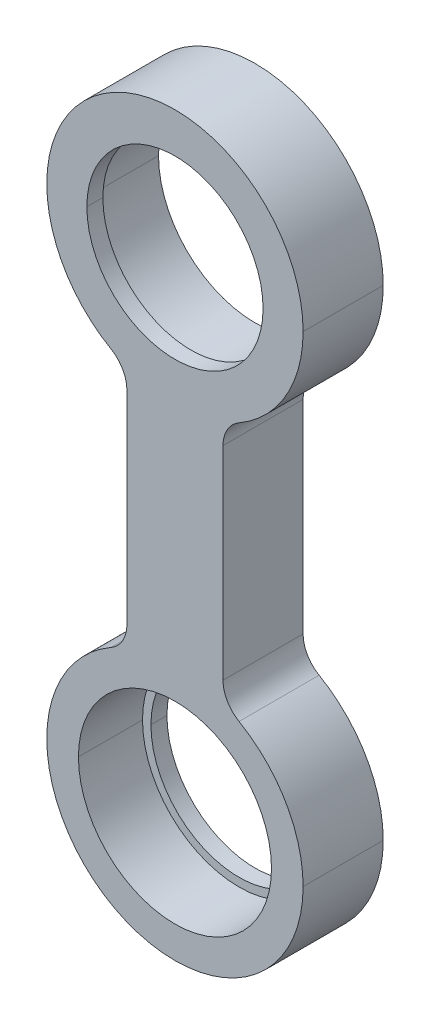
ISO-10303-21;
HEADER;
FILE_DESCRIPTION(('STEP AP214'),'2;1');
FILE_NAME('part.step','',(''),(''),'','','');
FILE_SCHEMA(('AUTOMOTIVE_DESIGN { 1 0 10303 214 1 1 1 1 }'));
ENDSEC;
DATA;
#1=APPLICATION_CONTEXT('core data for automotive mechanical design processes');
#2=APPLICATION_PROTOCOL_DEFINITION('international standard','automotive_design',2000,#1);
#3=PRODUCT_CONTEXT('',#1,'mechanical');
#4=PRODUCT('Part','Part','',(#3));
#5=PRODUCT_RELATED_PRODUCT_CATEGORY('part','',(#4));
#6=PRODUCT_DEFINITION_FORMATION('','',#4);
#7=PRODUCT_DEFINITION_CONTEXT('part definition',#1,'design');
#8=PRODUCT_DEFINITION('design','',#6,#7);
#9=PRODUCT_DEFINITION_SHAPE('','',#8);
#10=(LENGTH_UNIT() NAMED_UNIT(*) SI_UNIT(.MILLI.,.METRE.));
#11=(NAMED_UNIT(*) PLANE_ANGLE_UNIT() SI_UNIT($,.RADIAN.));
#12=(NAMED_UNIT(*) SI_UNIT($,.STERADIAN.) SOLID_ANGLE_UNIT());
#13=UNCERTAINTY_MEASURE_WITH_UNIT(LENGTH_MEASURE(1.E-05),#10,'distance_accuracy_value','');
#14=(GEOMETRIC_REPRESENTATION_CONTEXT(3) GLOBAL_UNCERTAINTY_ASSIGNED_CONTEXT((#13)) GLOBAL_UNIT_ASSIGNED_CONTEXT((#10,
#11,#12)) REPRESENTATION_CONTEXT('',''));
#15=CARTESIAN_POINT('',(0.,0.,0.));
#16=DIRECTION('',(0.,0.,1.));
#17=DIRECTION('',(1.,0.,0.));
#18=AXIS2_PLACEMENT_3D('',#15,#16,#17);
#19=CARTESIAN_POINT('',(0.,0.,1.));
#20=DIRECTION('',(0.,0.,-1.));
#21=DIRECTION('',(-1.,0.,0.));
#22=AXIS2_PLACEMENT_3D('',#19,#20,#21);
#23=CYLINDRICAL_SURFACE('',#22,5.5);
#24=DIRECTION('',(0.,0.,-1.));
#25=VECTOR('',#24,1.);
#26=CARTESIAN_POINT('',(5.5,0.,1.));
#27=LINE('',#26,#25);
#28=CARTESIAN_POINT('',(5.5,0.,1.));
#29=VERTEX_POINT('',#28);
#30=CARTESIAN_POINT('',(5.5,0.,0.));
#31=VERTEX_POINT('',#30);
#32=EDGE_CURVE('E480',#29,#31,#27,.T.);
#33=ORIENTED_EDGE('',*,*,#32,.F.);
#34=CARTESIAN_POINT('',(0.,0.,1.));
#35=DIRECTION('',(0.,0.,-1.));
#36=DIRECTION('',(-1.,0.,0.));
#37=AXIS2_PLACEMENT_3D('',#34,#35,#36);
#38=CIRCLE('',#37,5.5);
#39=CARTESIAN_POINT('',(-5.5,0.,1.));
#40=VERTEX_POINT('',#39);
#41=EDGE_CURVE('E9',#40,#29,#38,.T.);
#42=ORIENTED_EDGE('',*,*,#41,.F.);
#43=DIRECTION('',(0.,0.,-1.));
#44=VECTOR('',#43,1.);
#45=CARTESIAN_POINT('',(-5.5,0.,1.));
#46=LINE('',#45,#44);
#47=CARTESIAN_POINT('',(-5.5,0.,0.));
#48=VERTEX_POINT('',#47);
#49=EDGE_CURVE('E405',#40,#48,#46,.T.);
#50=ORIENTED_EDGE('',*,*,#49,.T.);
#51=CARTESIAN_POINT('',(0.,0.,0.));
#52=DIRECTION('',(0.,0.,-1.));
#53=DIRECTION('',(-1.,0.,0.));
#54=AXIS2_PLACEMENT_3D('',#51,#52,#53);
#55=CIRCLE('',#54,5.5);
#56=EDGE_CURVE('E372',#48,#31,#55,.T.);
#57=ORIENTED_EDGE('',*,*,#56,.T.);
#58=EDGE_LOOP('',(#33,#42,#50,#57));
#59=FACE_BOUND('',#58,.T.);
#60=ADVANCED_FACE('F15',(#59),#23,.F.);
#61=CARTESIAN_POINT('',(0.,0.,1.));
#62=DIRECTION('',(0.,0.,-1.));
#63=DIRECTION('',(0.,-1.,0.));
#64=AXIS2_PLACEMENT_3D('',#61,#62,#63);
#65=PLANE('',#64);
#66=ORIENTED_EDGE('',*,*,#41,.T.);
#67=CARTESIAN_POINT('',(0.,0.,1.));
#68=DIRECTION('',(0.,0.,-1.));
#69=DIRECTION('',(-1.,0.,0.));
#70=AXIS2_PLACEMENT_3D('',#67,#68,#69);
#71=CIRCLE('',#70,5.5);
#72=EDGE_CURVE('E487',#29,#40,#71,.T.);
#73=ORIENTED_EDGE('',*,*,#72,.T.);
#74=EDGE_LOOP('',(#66,#73));
#75=FACE_BOUND('',#74,.T.);
#76=CARTESIAN_POINT('',(0.,0.,1.));
#77=DIRECTION('',(0.,0.,-1.));
#78=DIRECTION('',(-1.,0.,0.));
#79=AXIS2_PLACEMENT_3D('',#76,#77,#78);
#80=CIRCLE('',#79,6.025);
#81=CARTESIAN_POINT('',(-6.025,0.,1.));
#82=VERTEX_POINT('',#81);
#83=CARTESIAN_POINT('',(6.025,0.,1.));
#84=VERTEX_POINT('',#83);
#85=EDGE_CURVE('E330',#82,#84,#80,.T.);
#86=ORIENTED_EDGE('',*,*,#85,.F.);
#87=CARTESIAN_POINT('',(0.,0.,1.));
#88=DIRECTION('',(0.,0.,-1.));
#89=DIRECTION('',(-1.,0.,0.));
#90=AXIS2_PLACEMENT_3D('',#87,#88,#89);
#91=CIRCLE('',#90,6.025);
#92=EDGE_CURVE('E319',#84,#82,#91,.T.);
#93=ORIENTED_EDGE('',*,*,#92,.F.);
#94=EDGE_LOOP('',(#86,#93));
#95=FACE_BOUND('',#94,.T.);
#96=ADVANCED_FACE('F472',(#75,#95),#65,.F.);
#97=CARTESIAN_POINT('',(0.,30.,4.));
#98=DIRECTION('',(0.,0.,1.));
#99=DIRECTION('',(1.,0.,0.));
#100=AXIS2_PLACEMENT_3D('',#97,#98,#99);
#101=CYLINDRICAL_SURFACE('',#100,5.5);
#102=DIRECTION('',(0.,0.,1.));
#103=VECTOR('',#102,1.);
#104=CARTESIAN_POINT('',(-5.5,30.,4.));
#105=LINE('',#104,#103);
#106=CARTESIAN_POINT('',(-5.5,30.,4.));
#107=VERTEX_POINT('',#106);
#108=CARTESIAN_POINT('',(-5.5,30.,5.));
#109=VERTEX_POINT('',#108);
#110=EDGE_CURVE('E396',#107,#109,#105,.T.);
#111=ORIENTED_EDGE('',*,*,#110,.F.);
#112=CARTESIAN_POINT('',(0.,30.,4.));
#113=DIRECTION('',(0.,0.,1.));
#114=DIRECTION('',(1.,0.,0.));
#115=AXIS2_PLACEMENT_3D('',#112,#113,#114);
#116=CIRCLE('',#115,5.5);
#117=CARTESIAN_POINT('',(5.5,30.,4.));
#118=VERTEX_POINT('',#117);
#119=EDGE_CURVE('E23',#118,#107,#116,.T.);
#120=ORIENTED_EDGE('',*,*,#119,.F.);
#121=DIRECTION('',(0.,0.,1.));
#122=VECTOR('',#121,1.);
#123=CARTESIAN_POINT('',(5.5,30.,4.));
#124=LINE('',#123,#122);
#125=CARTESIAN_POINT('',(5.5,30.,5.));
#126=VERTEX_POINT('',#125);
#127=EDGE_CURVE('E231',#118,#126,#124,.T.);
#128=ORIENTED_EDGE('',*,*,#127,.T.);
#129=CARTESIAN_POINT('',(0.,30.,5.));
#130=DIRECTION('',(0.,0.,1.));
#131=DIRECTION('',(1.,0.,0.));
#132=AXIS2_PLACEMENT_3D('',#129,#130,#131);
#133=CIRCLE('',#132,5.5);
#134=EDGE_CURVE('E213',#126,#109,#133,.T.);
#135=ORIENTED_EDGE('',*,*,#134,.T.);
#136=EDGE_LOOP('',(#111,#120,#128,#135));
#137=FACE_BOUND('',#136,.T.);
#138=ADVANCED_FACE('F397',(#137),#101,.F.);
#139=CARTESIAN_POINT('',(0.,30.,4.));
#140=DIRECTION('',(0.,0.,1.));
#141=DIRECTION('',(1.,0.,0.));
#142=AXIS2_PLACEMENT_3D('',#139,#140,#141);
#143=PLANE('',#142);
#144=ORIENTED_EDGE('',*,*,#119,.T.);
#145=CARTESIAN_POINT('',(0.,30.,4.));
#146=DIRECTION('',(0.,0.,1.));
#147=DIRECTION('',(1.,0.,0.));
#148=AXIS2_PLACEMENT_3D('',#145,#146,#147);
#149=CIRCLE('',#148,5.5);
#150=EDGE_CURVE('E392',#107,#118,#149,.T.);
#151=ORIENTED_EDGE('',*,*,#150,.T.);
#152=EDGE_LOOP('',(#144,#151));
#153=FACE_BOUND('',#152,.T.);
#154=CARTESIAN_POINT('',(0.,30.,4.));
#155=DIRECTION('',(0.,0.,1.));
#156=DIRECTION('',(1.,0.,0.));
#157=AXIS2_PLACEMENT_3D('',#154,#155,#156);
#158=CIRCLE('',#157,6.025);
#159=CARTESIAN_POINT('',(-6.025,30.,4.));
#160=VERTEX_POINT('',#159);
#161=CARTESIAN_POINT('',(6.025,30.,4.));
#162=VERTEX_POINT('',#161);
#163=EDGE_CURVE('E286',#160,#162,#158,.T.);
#164=ORIENTED_EDGE('',*,*,#163,.F.);
#165=CARTESIAN_POINT('',(0.,30.,4.));
#166=DIRECTION('',(0.,0.,1.));
#167=DIRECTION('',(1.,0.,0.));
#168=AXIS2_PLACEMENT_3D('',#165,#166,#167);
#169=CIRCLE('',#168,6.025);
#170=EDGE_CURVE('E333',#162,#160,#169,.T.);
#171=ORIENTED_EDGE('',*,*,#170,.F.);
#172=EDGE_LOOP('',(#164,#171));
#173=FACE_BOUND('',#172,.T.);
#174=ADVANCED_FACE('F389',(#153,#173),#143,.F.);
#175=CARTESIAN_POINT('',(-5.,8.66025403784439,5.));
#176=DIRECTION('',(0.,0.,-1.));
#177=DIRECTION('',(-1.,0.,0.));
#178=AXIS2_PLACEMENT_3D('',#175,#176,#177);
#179=CYLINDRICAL_SURFACE('',#178,2.);
#180=CARTESIAN_POINT('',(-5.,8.66025403784439,5.));
#181=DIRECTION('',(0.,0.,-1.));
#182=DIRECTION('',(1.,0.,0.));
#183=AXIS2_PLACEMENT_3D('',#180,#181,#182);
#184=CIRCLE('',#183,2.);
#185=CARTESIAN_POINT('',(-3.,8.66025403784439,5.));
#186=VERTEX_POINT('',#185);
#187=CARTESIAN_POINT('',(-4.,6.92820323027551,5.));
#188=VERTEX_POINT('',#187);
#189=EDGE_CURVE('E258',#186,#188,#184,.T.);
#190=ORIENTED_EDGE('',*,*,#189,.F.);
#191=DIRECTION('',(0.,0.,1.));
#192=VECTOR('',#191,1.);
#193=CARTESIAN_POINT('',(-3.,8.66025403784439,5.));
#194=LINE('',#193,#192);
#195=CARTESIAN_POINT('',(-3.,8.66025403784439,0.));
#196=VERTEX_POINT('',#195);
#197=EDGE_CURVE('E47',#196,#186,#194,.T.);
#198=ORIENTED_EDGE('',*,*,#197,.F.);
#199=CARTESIAN_POINT('',(-5.,8.66025403784439,0.));
#200=DIRECTION('',(0.,0.,1.));
#201=DIRECTION('',(1.,0.,0.));
#202=AXIS2_PLACEMENT_3D('',#199,#200,#201);
#203=CIRCLE('',#202,2.);
#204=CARTESIAN_POINT('',(-4.,6.92820323027551,0.));
#205=VERTEX_POINT('',#204);
#206=EDGE_CURVE('E342',#205,#196,#203,.T.);
#207=ORIENTED_EDGE('',*,*,#206,.F.);
#208=DIRECTION('',(0.,0.,-1.));
#209=VECTOR('',#208,1.);
#210=CARTESIAN_POINT('',(-4.,6.92820323027551,5.));
#211=LINE('',#210,#209);
#212=EDGE_CURVE('E245',#188,#205,#211,.T.);
#213=ORIENTED_EDGE('',*,*,#212,.F.);
#214=EDGE_LOOP('',(#190,#198,#207,#213));
#215=FACE_BOUND('',#214,.T.);
#216=ADVANCED_FACE('F461',(#215),#179,.F.);
#217=CARTESIAN_POINT('',(5.,8.66025403784439,5.));
#218=DIRECTION('',(0.,0.,-1.));
#219=DIRECTION('',(-1.,0.,0.));
#220=AXIS2_PLACEMENT_3D('',#217,#218,#219);
#221=CYLINDRICAL_SURFACE('',#220,2.);
#222=CARTESIAN_POINT('',(5.,8.66025403784439,5.));
#223=DIRECTION('',(0.,0.,-1.));
#224=DIRECTION('',(1.,0.,0.));
#225=AXIS2_PLACEMENT_3D('',#222,#223,#224);
#226=CIRCLE('',#225,2.);
#227=CARTESIAN_POINT('',(4.,6.92820323027551,5.));
#228=VERTEX_POINT('',#227);
#229=CARTESIAN_POINT('',(3.,8.66025403784439,5.));
#230=VERTEX_POINT('',#229);
#231=EDGE_CURVE('E201',#228,#230,#226,.T.);
#232=ORIENTED_EDGE('',*,*,#231,.F.);
#233=DIRECTION('',(0.,0.,1.));
#234=VECTOR('',#233,1.);
#235=CARTESIAN_POINT('',(4.,6.92820323027551,5.));
#236=LINE('',#235,#234);
#237=CARTESIAN_POINT('',(4.,6.92820323027551,0.));
#238=VERTEX_POINT('',#237);
#239=EDGE_CURVE('E205',#238,#228,#236,.T.);
#240=ORIENTED_EDGE('',*,*,#239,.F.);
#241=CARTESIAN_POINT('',(5.,8.66025403784439,0.));
#242=DIRECTION('',(0.,0.,1.));
#243=DIRECTION('',(1.,0.,0.));
#244=AXIS2_PLACEMENT_3D('',#241,#242,#243);
#245=CIRCLE('',#244,2.);
#246=CARTESIAN_POINT('',(3.,8.66025403784439,0.));
#247=VERTEX_POINT('',#246);
#248=EDGE_CURVE('E365',#247,#238,#245,.T.);
#249=ORIENTED_EDGE('',*,*,#248,.F.);
#250=DIRECTION('',(0.,0.,-1.));
#251=VECTOR('',#250,1.);
#252=CARTESIAN_POINT('',(3.,8.66025403784439,0.));
#253=LINE('',#252,#251);
#254=EDGE_CURVE('E207',#230,#247,#253,.T.);
#255=ORIENTED_EDGE('',*,*,#254,.F.);
#256=EDGE_LOOP('',(#232,#240,#249,#255));
#257=FACE_BOUND('',#256,.T.);
#258=ADVANCED_FACE('F203',(#257),#221,.F.);
#259=CARTESIAN_POINT('',(5.,21.3397459621556,5.));
#260=DIRECTION('',(0.,0.,-1.));
#261=DIRECTION('',(-1.,0.,0.));
#262=AXIS2_PLACEMENT_3D('',#259,#260,#261);
#263=CYLINDRICAL_SURFACE('',#262,2.);
#264=CARTESIAN_POINT('',(5.,21.3397459621556,5.));
#265=DIRECTION('',(0.,0.,-1.));
#266=DIRECTION('',(1.,0.,0.));
#267=AXIS2_PLACEMENT_3D('',#264,#265,#266);
#268=CIRCLE('',#267,2.);
#269=CARTESIAN_POINT('',(3.,21.3397459621556,5.));
#270=VERTEX_POINT('',#269);
#271=CARTESIAN_POINT('',(4.,23.0717967697245,5.));
#272=VERTEX_POINT('',#271);
#273=EDGE_CURVE('E345',#270,#272,#268,.T.);
#274=ORIENTED_EDGE('',*,*,#273,.F.);
#275=DIRECTION('',(0.,0.,1.));
#276=VECTOR('',#275,1.);
#277=CARTESIAN_POINT('',(3.,21.3397459621556,5.));
#278=LINE('',#277,#276);
#279=CARTESIAN_POINT('',(3.,21.3397459621556,0.));
#280=VERTEX_POINT('',#279);
#281=EDGE_CURVE('E379',#280,#270,#278,.T.);
#282=ORIENTED_EDGE('',*,*,#281,.F.);
#283=CARTESIAN_POINT('',(5.,21.3397459621556,0.));
#284=DIRECTION('',(0.,0.,1.));
#285=DIRECTION('',(1.,0.,0.));
#286=AXIS2_PLACEMENT_3D('',#283,#284,#285);
#287=CIRCLE('',#286,2.);
#288=CARTESIAN_POINT('',(4.,23.0717967697245,0.));
#289=VERTEX_POINT('',#288);
#290=EDGE_CURVE('E276',#289,#280,#287,.T.);
#291=ORIENTED_EDGE('',*,*,#290,.F.);
#292=DIRECTION('',(0.,0.,-1.));
#293=VECTOR('',#292,1.);
#294=CARTESIAN_POINT('',(4.,23.0717967697245,5.));
#295=LINE('',#294,#293);
#296=EDGE_CURVE('E248',#272,#289,#295,.T.);
#297=ORIENTED_EDGE('',*,*,#296,.F.);
#298=EDGE_LOOP('',(#274,#282,#291,#297));
#299=FACE_BOUND('',#298,.T.);
#300=ADVANCED_FACE('F449',(#299),#263,.F.);
#301=CARTESIAN_POINT('',(-5.,21.3397459621556,5.));
#302=DIRECTION('',(0.,0.,-1.));
#303=DIRECTION('',(-1.,0.,0.));
#304=AXIS2_PLACEMENT_3D('',#301,#302,#303);
#305=CYLINDRICAL_SURFACE('',#304,2.);
#306=CARTESIAN_POINT('',(-5.,21.3397459621556,5.));
#307=DIRECTION('',(0.,0.,-1.));
#308=DIRECTION('',(1.,0.,0.));
#309=AXIS2_PLACEMENT_3D('',#306,#307,#308);
#310=CIRCLE('',#309,2.);
#311=CARTESIAN_POINT('',(-4.,23.0717967697245,5.));
#312=VERTEX_POINT('',#311);
#313=CARTESIAN_POINT('',(-3.,21.3397459621556,5.));
#314=VERTEX_POINT('',#313);
#315=EDGE_CURVE('E307',#312,#314,#310,.T.);
#316=ORIENTED_EDGE('',*,*,#315,.F.);
#317=DIRECTION('',(0.,0.,1.));
#318=VECTOR('',#317,1.);
#319=CARTESIAN_POINT('',(-4.,23.0717967697245,5.));
#320=LINE('',#319,#318);
#321=CARTESIAN_POINT('',(-4.,23.0717967697245,0.));
#322=VERTEX_POINT('',#321);
#323=EDGE_CURVE('E282',#322,#312,#320,.T.);
#324=ORIENTED_EDGE('',*,*,#323,.F.);
#325=CARTESIAN_POINT('',(-5.,21.3397459621556,0.));
#326=DIRECTION('',(0.,0.,1.));
#327=DIRECTION('',(1.,0.,0.));
#328=AXIS2_PLACEMENT_3D('',#325,#326,#327);
#329=CIRCLE('',#328,2.);
#330=CARTESIAN_POINT('',(-3.,21.3397459621556,0.));
#331=VERTEX_POINT('',#330);
#332=EDGE_CURVE('E341',#331,#322,#329,.T.);
#333=ORIENTED_EDGE('',*,*,#332,.F.);
#334=DIRECTION('',(0.,0.,-1.));
#335=VECTOR('',#334,1.);
#336=CARTESIAN_POINT('',(-3.,21.3397459621556,0.));
#337=LINE('',#336,#335);
#338=EDGE_CURVE('E36',#314,#331,#337,.T.);
#339=ORIENTED_EDGE('',*,*,#338,.F.);
#340=EDGE_LOOP('',(#316,#324,#333,#339));
#341=FACE_BOUND('',#340,.T.);
#342=ADVANCED_FACE('F436',(#341),#305,.F.);
#343=CARTESIAN_POINT('',(3.,7.41619848709566,5.));
#344=DIRECTION('',(-1.,0.,0.));
#345=DIRECTION('',(0.,0.,1.));
#346=AXIS2_PLACEMENT_3D('',#343,#344,#345);
#347=PLANE('',#346);
#348=DIRECTION('',(0.,1.,0.));
#349=VECTOR('',#348,1.);
#350=CARTESIAN_POINT('',(3.,7.41619848709566,0.));
#351=LINE('',#350,#349);
#352=EDGE_CURVE('E280',#247,#280,#351,.T.);
#353=ORIENTED_EDGE('',*,*,#352,.T.);
#354=ORIENTED_EDGE('',*,*,#281,.T.);
#355=DIRECTION('',(0.,1.,0.));
#356=VECTOR('',#355,1.);
#357=CARTESIAN_POINT('',(3.,7.41619848709566,5.));
#358=LINE('',#357,#356);
#359=EDGE_CURVE('E337',#230,#270,#358,.T.);
#360=ORIENTED_EDGE('',*,*,#359,.F.);
#361=ORIENTED_EDGE('',*,*,#254,.T.);
#362=EDGE_LOOP('',(#353,#354,#360,#361));
#363=FACE_BOUND('',#362,.T.);
#364=ADVANCED_FACE('F451',(#363),#347,.F.);
#365=CARTESIAN_POINT('',(0.,0.,5.));
#366=DIRECTION('',(0.,0.,-1.));
#367=DIRECTION('',(-1.,0.,0.));
#368=AXIS2_PLACEMENT_3D('',#365,#366,#367);
#369=CYLINDRICAL_SURFACE('',#368,8.);
#370=DIRECTION('',(0.,0.,-1.));
#371=VECTOR('',#370,1.);
#372=CARTESIAN_POINT('',(-8.,0.,5.));
#373=LINE('',#372,#371);
#374=CARTESIAN_POINT('',(-8.,0.,5.));
#375=VERTEX_POINT('',#374);
#376=CARTESIAN_POINT('',(-8.,0.,0.));
#377=VERTEX_POINT('',#376);
#378=EDGE_CURVE('E251',#375,#377,#373,.T.);
#379=ORIENTED_EDGE('',*,*,#378,.F.);
#380=CARTESIAN_POINT('',(0.,0.,5.));
#381=DIRECTION('',(0.,0.,1.));
#382=DIRECTION('',(1.,0.,0.));
#383=AXIS2_PLACEMENT_3D('',#380,#381,#382);
#384=CIRCLE('',#383,8.);
#385=EDGE_CURVE('E214',#188,#375,#384,.T.);
#386=ORIENTED_EDGE('',*,*,#385,.F.);
#387=ORIENTED_EDGE('',*,*,#212,.T.);
#388=CARTESIAN_POINT('',(0.,0.,0.));
#389=DIRECTION('',(0.,0.,1.));
#390=DIRECTION('',(1.,0.,0.));
#391=AXIS2_PLACEMENT_3D('',#388,#389,#390);
#392=CIRCLE('',#391,8.);
#393=EDGE_CURVE('E357',#205,#377,#392,.T.);
#394=ORIENTED_EDGE('',*,*,#393,.T.);
#395=EDGE_LOOP('',(#379,#386,#387,#394));
#396=FACE_BOUND('',#395,.T.);
#397=ADVANCED_FACE('F460',(#396),#369,.T.);
#398=CARTESIAN_POINT('',(-3.,7.41619848709566,5.));
#399=DIRECTION('',(1.,0.,0.));
#400=DIRECTION('',(0.,1.,0.));
#401=AXIS2_PLACEMENT_3D('',#398,#399,#400);
#402=PLANE('',#401);
#403=DIRECTION('',(0.,-1.,0.));
#404=VECTOR('',#403,1.);
#405=CARTESIAN_POINT('',(-3.,7.41619848709566,5.));
#406=LINE('',#405,#404);
#407=EDGE_CURVE('E294',#314,#186,#406,.T.);
#408=ORIENTED_EDGE('',*,*,#407,.F.);
#409=ORIENTED_EDGE('',*,*,#338,.T.);
#410=DIRECTION('',(0.,-1.,0.));
#411=VECTOR('',#410,1.);
#412=CARTESIAN_POINT('',(-3.,7.41619848709566,0.));
#413=LINE('',#412,#411);
#414=EDGE_CURVE('E338',#331,#196,#413,.T.);
#415=ORIENTED_EDGE('',*,*,#414,.T.);
#416=ORIENTED_EDGE('',*,*,#197,.T.);
#417=EDGE_LOOP('',(#408,#409,#415,#416));
#418=FACE_BOUND('',#417,.T.);
#419=ADVANCED_FACE('F528',(#418),#402,.F.);
#420=CARTESIAN_POINT('',(0.,30.,5.));
#421=DIRECTION('',(0.,0.,-1.));
#422=DIRECTION('',(-1.,0.,0.));
#423=AXIS2_PLACEMENT_3D('',#420,#421,#422);
#424=CYLINDRICAL_SURFACE('',#423,8.);
#425=DIRECTION('',(0.,0.,-1.));
#426=VECTOR('',#425,1.);
#427=CARTESIAN_POINT('',(8.,30.,5.));
#428=LINE('',#427,#426);
#429=CARTESIAN_POINT('',(8.,30.,5.));
#430=VERTEX_POINT('',#429);
#431=CARTESIAN_POINT('',(8.,30.,0.));
#432=VERTEX_POINT('',#431);
#433=EDGE_CURVE('E259',#430,#432,#428,.T.);
#434=ORIENTED_EDGE('',*,*,#433,.F.);
#435=CARTESIAN_POINT('',(0.,30.,5.));
#436=DIRECTION('',(0.,0.,1.));
#437=DIRECTION('',(1.,0.,0.));
#438=AXIS2_PLACEMENT_3D('',#435,#436,#437);
#439=CIRCLE('',#438,8.);
#440=EDGE_CURVE('E311',#272,#430,#439,.T.);
#441=ORIENTED_EDGE('',*,*,#440,.F.);
#442=ORIENTED_EDGE('',*,*,#296,.T.);
#443=CARTESIAN_POINT('',(0.,30.,0.));
#444=DIRECTION('',(0.,0.,1.));
#445=DIRECTION('',(1.,0.,0.));
#446=AXIS2_PLACEMENT_3D('',#443,#444,#445);
#447=CIRCLE('',#446,8.);
#448=EDGE_CURVE('E281',#289,#432,#447,.T.);
#449=ORIENTED_EDGE('',*,*,#448,.T.);
#450=EDGE_LOOP('',(#434,#441,#442,#449));
#451=FACE_BOUND('',#450,.T.);
#452=ADVANCED_FACE('F444',(#451),#424,.T.);
#453=CARTESIAN_POINT('',(0.,30.,0.));
#454=DIRECTION('',(0.,0.,1.));
#455=DIRECTION('',(1.,0.,0.));
#456=AXIS2_PLACEMENT_3D('',#453,#454,#455);
#457=PLANE('',#456);
#458=ORIENTED_EDGE('',*,*,#56,.F.);
#459=CARTESIAN_POINT('',(0.,0.,0.));
#460=DIRECTION('',(0.,0.,-1.));
#461=DIRECTION('',(-1.,0.,0.));
#462=AXIS2_PLACEMENT_3D('',#459,#460,#461);
#463=CIRCLE('',#462,5.5);
#464=EDGE_CURVE('E411',#31,#48,#463,.T.);
#465=ORIENTED_EDGE('',*,*,#464,.F.);
#466=EDGE_LOOP('',(#458,#465));
#467=FACE_BOUND('',#466,.T.);
#468=CARTESIAN_POINT('',(0.,30.,0.));
#469=DIRECTION('',(0.,0.,1.));
#470=DIRECTION('',(1.,0.,0.));
#471=AXIS2_PLACEMENT_3D('',#468,#469,#470);
#472=CIRCLE('',#471,6.025);
#473=CARTESIAN_POINT('',(-6.025,30.,0.));
#474=VERTEX_POINT('',#473);
#475=CARTESIAN_POINT('',(6.025,30.,0.));
#476=VERTEX_POINT('',#475);
#477=EDGE_CURVE('E298',#474,#476,#472,.T.);
#478=ORIENTED_EDGE('',*,*,#477,.T.);
#479=CARTESIAN_POINT('',(0.,30.,0.));
#480=DIRECTION('',(0.,0.,1.));
#481=DIRECTION('',(1.,0.,0.));
#482=AXIS2_PLACEMENT_3D('',#479,#480,#481);
#483=CIRCLE('',#482,6.025);
#484=EDGE_CURVE('E334',#476,#474,#483,.T.);
#485=ORIENTED_EDGE('',*,*,#484,.T.);
#486=EDGE_LOOP('',(#478,#485));
#487=FACE_BOUND('',#486,.T.);
#488=ORIENTED_EDGE('',*,*,#448,.F.);
#489=ORIENTED_EDGE('',*,*,#290,.T.);
#490=ORIENTED_EDGE('',*,*,#352,.F.);
#491=ORIENTED_EDGE('',*,*,#248,.T.);
#492=CARTESIAN_POINT('',(0.,0.,0.));
#493=DIRECTION('',(0.,0.,1.));
#494=DIRECTION('',(1.,0.,0.));
#495=AXIS2_PLACEMENT_3D('',#492,#493,#494);
#496=CIRCLE('',#495,8.);
#497=CARTESIAN_POINT('',(8.,0.,0.));
#498=VERTEX_POINT('',#497);
#499=EDGE_CURVE('E222',#498,#238,#496,.T.);
#500=ORIENTED_EDGE('',*,*,#499,.F.);
#501=CARTESIAN_POINT('',(0.,0.,0.));
#502=DIRECTION('',(0.,0.,1.));
#503=DIRECTION('',(1.,0.,0.));
#504=AXIS2_PLACEMENT_3D('',#501,#502,#503);
#505=CIRCLE('',#504,8.);
#506=EDGE_CURVE('E252',#377,#498,#505,.T.);
#507=ORIENTED_EDGE('',*,*,#506,.F.);
#508=ORIENTED_EDGE('',*,*,#393,.F.);
#509=ORIENTED_EDGE('',*,*,#206,.T.);
#510=ORIENTED_EDGE('',*,*,#414,.F.);
#511=ORIENTED_EDGE('',*,*,#332,.T.);
#512=CARTESIAN_POINT('',(0.,30.,0.));
#513=DIRECTION('',(0.,0.,1.));
#514=DIRECTION('',(1.,0.,0.));
#515=AXIS2_PLACEMENT_3D('',#512,#513,#514);
#516=CIRCLE('',#515,8.);
#517=CARTESIAN_POINT('',(-8.,30.,0.));
#518=VERTEX_POINT('',#517);
#519=EDGE_CURVE('E275',#518,#322,#516,.T.);
#520=ORIENTED_EDGE('',*,*,#519,.F.);
#521=CARTESIAN_POINT('',(0.,30.,0.));
#522=DIRECTION('',(0.,0.,1.));
#523=DIRECTION('',(1.,0.,0.));
#524=AXIS2_PLACEMENT_3D('',#521,#522,#523);
#525=CIRCLE('',#524,8.);
#526=EDGE_CURVE('E263',#432,#518,#525,.T.);
#527=ORIENTED_EDGE('',*,*,#526,.F.);
#528=EDGE_LOOP('',(#488,#489,#490,#491,#500,#507,#508,#509,#510,#511,#520,#527));
#529=FACE_BOUND('',#528,.T.);
#530=ADVANCED_FACE('F433',(#467,#487,#529),#457,.F.);
#531=CARTESIAN_POINT('',(0.,30.,5.));
#532=DIRECTION('',(0.,0.,1.));
#533=DIRECTION('',(1.,0.,0.));
#534=AXIS2_PLACEMENT_3D('',#531,#532,#533);
#535=PLANE('',#534);
#536=ORIENTED_EDGE('',*,*,#134,.F.);
#537=CARTESIAN_POINT('',(0.,30.,5.));
#538=DIRECTION('',(0.,0.,1.));
#539=DIRECTION('',(1.,0.,0.));
#540=AXIS2_PLACEMENT_3D('',#537,#538,#539);
#541=CIRCLE('',#540,5.5);
#542=EDGE_CURVE('E240',#109,#126,#541,.T.);
#543=ORIENTED_EDGE('',*,*,#542,.F.);
#544=EDGE_LOOP('',(#536,#543));
#545=FACE_BOUND('',#544,.T.);
#546=CARTESIAN_POINT('',(0.,0.,5.));
#547=DIRECTION('',(0.,0.,1.));
#548=DIRECTION('',(1.,0.,0.));
#549=AXIS2_PLACEMENT_3D('',#546,#547,#548);
#550=CIRCLE('',#549,6.025);
#551=CARTESIAN_POINT('',(-6.025,0.,5.));
#552=VERTEX_POINT('',#551);
#553=CARTESIAN_POINT('',(6.025,0.,5.));
#554=VERTEX_POINT('',#553);
#555=EDGE_CURVE('E306',#552,#554,#550,.T.);
#556=ORIENTED_EDGE('',*,*,#555,.F.);
#557=CARTESIAN_POINT('',(0.,0.,5.));
#558=DIRECTION('',(0.,0.,1.));
#559=DIRECTION('',(1.,0.,0.));
#560=AXIS2_PLACEMENT_3D('',#557,#558,#559);
#561=CIRCLE('',#560,6.025);
#562=EDGE_CURVE('E327',#554,#552,#561,.T.);
#563=ORIENTED_EDGE('',*,*,#562,.F.);
#564=EDGE_LOOP('',(#556,#563));
#565=FACE_BOUND('',#564,.T.);
#566=ORIENTED_EDGE('',*,*,#359,.T.);
#567=ORIENTED_EDGE('',*,*,#273,.T.);
#568=ORIENTED_EDGE('',*,*,#440,.T.);
#569=CARTESIAN_POINT('',(0.,30.,5.));
#570=DIRECTION('',(0.,0.,1.));
#571=DIRECTION('',(1.,0.,0.));
#572=AXIS2_PLACEMENT_3D('',#569,#570,#571);
#573=CIRCLE('',#572,8.);
#574=CARTESIAN_POINT('',(-8.,30.,5.));
#575=VERTEX_POINT('',#574);
#576=EDGE_CURVE('E255',#430,#575,#573,.T.);
#577=ORIENTED_EDGE('',*,*,#576,.T.);
#578=CARTESIAN_POINT('',(0.,30.,5.));
#579=DIRECTION('',(0.,0.,1.));
#580=DIRECTION('',(1.,0.,0.));
#581=AXIS2_PLACEMENT_3D('',#578,#579,#580);
#582=CIRCLE('',#581,8.);
#583=EDGE_CURVE('E271',#575,#312,#582,.T.);
#584=ORIENTED_EDGE('',*,*,#583,.T.);
#585=ORIENTED_EDGE('',*,*,#315,.T.);
#586=ORIENTED_EDGE('',*,*,#407,.T.);
#587=ORIENTED_EDGE('',*,*,#189,.T.);
#588=ORIENTED_EDGE('',*,*,#385,.T.);
#589=CARTESIAN_POINT('',(0.,0.,5.));
#590=DIRECTION('',(0.,0.,1.));
#591=DIRECTION('',(1.,0.,0.));
#592=AXIS2_PLACEMENT_3D('',#589,#590,#591);
#593=CIRCLE('',#592,8.);
#594=CARTESIAN_POINT('',(8.,0.,5.));
#595=VERTEX_POINT('',#594);
#596=EDGE_CURVE('E224',#375,#595,#593,.T.);
#597=ORIENTED_EDGE('',*,*,#596,.T.);
#598=CARTESIAN_POINT('',(0.,0.,5.));
#599=DIRECTION('',(0.,0.,1.));
#600=DIRECTION('',(1.,0.,0.));
#601=AXIS2_PLACEMENT_3D('',#598,#599,#600);
#602=CIRCLE('',#601,8.);
#603=EDGE_CURVE('E220',#595,#228,#602,.T.);
#604=ORIENTED_EDGE('',*,*,#603,.T.);
#605=ORIENTED_EDGE('',*,*,#231,.T.);
#606=EDGE_LOOP('',(#566,#567,#568,#577,#584,#585,#586,#587,#588,#597,#604,#605));
#607=FACE_BOUND('',#606,.T.);
#608=ADVANCED_FACE('F226',(#545,#565,#607),#535,.T.);
#609=CARTESIAN_POINT('',(0.,30.,5.));
#610=DIRECTION('',(0.,0.,-1.));
#611=DIRECTION('',(-1.,0.,0.));
#612=AXIS2_PLACEMENT_3D('',#609,#610,#611);
#613=CYLINDRICAL_SURFACE('',#612,6.025);
#614=DIRECTION('',(0.,0.,-1.));
#615=VECTOR('',#614,1.);
#616=CARTESIAN_POINT('',(6.025,30.,5.));
#617=LINE('',#616,#615);
#618=EDGE_CURVE('E290',#162,#476,#617,.T.);
#619=ORIENTED_EDGE('',*,*,#618,.F.);
#620=ORIENTED_EDGE('',*,*,#170,.T.);
#621=DIRECTION('',(0.,0.,-1.));
#622=VECTOR('',#621,1.);
#623=CARTESIAN_POINT('',(-6.025,30.,5.));
#624=LINE('',#623,#622);
#625=EDGE_CURVE('E302',#160,#474,#624,.T.);
#626=ORIENTED_EDGE('',*,*,#625,.T.);
#627=ORIENTED_EDGE('',*,*,#484,.F.);
#628=EDGE_LOOP('',(#619,#620,#626,#627));
#629=FACE_BOUND('',#628,.T.);
#630=ADVANCED_FACE('F512',(#629),#613,.F.);
#631=CARTESIAN_POINT('',(0.,0.,5.));
#632=DIRECTION('',(0.,0.,-1.));
#633=DIRECTION('',(-1.,0.,0.));
#634=AXIS2_PLACEMENT_3D('',#631,#632,#633);
#635=CYLINDRICAL_SURFACE('',#634,6.025);
#636=DIRECTION('',(0.,0.,-1.));
#637=VECTOR('',#636,1.);
#638=CARTESIAN_POINT('',(6.025,0.,5.));
#639=LINE('',#638,#637);
#640=EDGE_CURVE('E315',#554,#84,#639,.T.);
#641=ORIENTED_EDGE('',*,*,#640,.F.);
#642=ORIENTED_EDGE('',*,*,#562,.T.);
#643=DIRECTION('',(0.,0.,-1.));
#644=VECTOR('',#643,1.);
#645=CARTESIAN_POINT('',(-6.025,0.,5.));
#646=LINE('',#645,#644);
#647=EDGE_CURVE('E323',#552,#82,#646,.T.);
#648=ORIENTED_EDGE('',*,*,#647,.T.);
#649=ORIENTED_EDGE('',*,*,#85,.T.);
#650=EDGE_LOOP('',(#641,#642,#648,#649));
#651=FACE_BOUND('',#650,.T.);
#652=ADVANCED_FACE('F514',(#651),#635,.F.);
#653=CARTESIAN_POINT('',(0.,0.,5.));
#654=DIRECTION('',(0.,0.,-1.));
#655=DIRECTION('',(-1.,0.,0.));
#656=AXIS2_PLACEMENT_3D('',#653,#654,#655);
#657=CYLINDRICAL_SURFACE('',#656,6.025);
#658=ORIENTED_EDGE('',*,*,#555,.T.);
#659=ORIENTED_EDGE('',*,*,#640,.T.);
#660=ORIENTED_EDGE('',*,*,#92,.T.);
#661=ORIENTED_EDGE('',*,*,#647,.F.);
#662=EDGE_LOOP('',(#658,#659,#660,#661));
#663=FACE_BOUND('',#662,.T.);
#664=ADVANCED_FACE('F520',(#663),#657,.F.);
#665=CARTESIAN_POINT('',(0.,30.,5.));
#666=DIRECTION('',(0.,0.,-1.));
#667=DIRECTION('',(-1.,0.,0.));
#668=AXIS2_PLACEMENT_3D('',#665,#666,#667);
#669=CYLINDRICAL_SURFACE('',#668,6.025);
#670=ORIENTED_EDGE('',*,*,#163,.T.);
#671=ORIENTED_EDGE('',*,*,#618,.T.);
#672=ORIENTED_EDGE('',*,*,#477,.F.);
#673=ORIENTED_EDGE('',*,*,#625,.F.);
#674=EDGE_LOOP('',(#670,#671,#672,#673));
#675=FACE_BOUND('',#674,.T.);
#676=ADVANCED_FACE('F509',(#675),#669,.F.);
#677=CARTESIAN_POINT('',(0.,30.,5.));
#678=DIRECTION('',(0.,0.,-1.));
#679=DIRECTION('',(-1.,0.,0.));
#680=AXIS2_PLACEMENT_3D('',#677,#678,#679);
#681=CYLINDRICAL_SURFACE('',#680,8.);
#682=ORIENTED_EDGE('',*,*,#583,.F.);
#683=DIRECTION('',(0.,0.,-1.));
#684=VECTOR('',#683,1.);
#685=CARTESIAN_POINT('',(-8.,30.,5.));
#686=LINE('',#685,#684);
#687=EDGE_CURVE('E267',#575,#518,#686,.T.);
#688=ORIENTED_EDGE('',*,*,#687,.T.);
#689=ORIENTED_EDGE('',*,*,#519,.T.);
#690=ORIENTED_EDGE('',*,*,#323,.T.);
#691=EDGE_LOOP('',(#682,#688,#689,#690));
#692=FACE_BOUND('',#691,.T.);
#693=ADVANCED_FACE('F427',(#692),#681,.T.);
#694=CARTESIAN_POINT('',(0.,30.,5.));
#695=DIRECTION('',(0.,0.,-1.));
#696=DIRECTION('',(-1.,0.,0.));
#697=AXIS2_PLACEMENT_3D('',#694,#695,#696);
#698=CYLINDRICAL_SURFACE('',#697,8.);
#699=ORIENTED_EDGE('',*,*,#576,.F.);
#700=ORIENTED_EDGE('',*,*,#433,.T.);
#701=ORIENTED_EDGE('',*,*,#526,.T.);
#702=ORIENTED_EDGE('',*,*,#687,.F.);
#703=EDGE_LOOP('',(#699,#700,#701,#702));
#704=FACE_BOUND('',#703,.T.);
#705=ADVANCED_FACE('F440',(#704),#698,.T.);
#706=CARTESIAN_POINT('',(0.,0.,5.));
#707=DIRECTION('',(0.,0.,-1.));
#708=DIRECTION('',(-1.,0.,0.));
#709=AXIS2_PLACEMENT_3D('',#706,#707,#708);
#710=CYLINDRICAL_SURFACE('',#709,8.);
#711=DIRECTION('',(0.,0.,-1.));
#712=VECTOR('',#711,1.);
#713=CARTESIAN_POINT('',(8.,0.,5.));
#714=LINE('',#713,#712);
#715=EDGE_CURVE('E230',#595,#498,#714,.T.);
#716=ORIENTED_EDGE('',*,*,#715,.F.);
#717=ORIENTED_EDGE('',*,*,#596,.F.);
#718=ORIENTED_EDGE('',*,*,#378,.T.);
#719=ORIENTED_EDGE('',*,*,#506,.T.);
#720=EDGE_LOOP('',(#716,#717,#718,#719));
#721=FACE_BOUND('',#720,.T.);
#722=ADVANCED_FACE('F456',(#721),#710,.T.);
#723=CARTESIAN_POINT('',(0.,0.,5.));
#724=DIRECTION('',(0.,0.,-1.));
#725=DIRECTION('',(-1.,0.,0.));
#726=AXIS2_PLACEMENT_3D('',#723,#724,#725);
#727=CYLINDRICAL_SURFACE('',#726,8.);
#728=ORIENTED_EDGE('',*,*,#603,.F.);
#729=ORIENTED_EDGE('',*,*,#715,.T.);
#730=ORIENTED_EDGE('',*,*,#499,.T.);
#731=ORIENTED_EDGE('',*,*,#239,.T.);
#732=EDGE_LOOP('',(#728,#729,#730,#731));
#733=FACE_BOUND('',#732,.T.);
#734=ADVANCED_FACE('F218',(#733),#727,.T.);
#735=CARTESIAN_POINT('',(0.,30.,4.));
#736=DIRECTION('',(0.,0.,1.));
#737=DIRECTION('',(1.,0.,0.));
#738=AXIS2_PLACEMENT_3D('',#735,#736,#737);
#739=CYLINDRICAL_SURFACE('',#738,5.5);
#740=ORIENTED_EDGE('',*,*,#150,.F.);
#741=ORIENTED_EDGE('',*,*,#110,.T.);
#742=ORIENTED_EDGE('',*,*,#542,.T.);
#743=ORIENTED_EDGE('',*,*,#127,.F.);
#744=EDGE_LOOP('',(#740,#741,#742,#743));
#745=FACE_BOUND('',#744,.T.);
#746=ADVANCED_FACE('F403',(#745),#739,.F.);
#747=CARTESIAN_POINT('',(0.,0.,1.));
#748=DIRECTION('',(0.,0.,-1.));
#749=DIRECTION('',(-1.,0.,0.));
#750=AXIS2_PLACEMENT_3D('',#747,#748,#749);
#751=CYLINDRICAL_SURFACE('',#750,5.5);
#752=ORIENTED_EDGE('',*,*,#72,.F.);
#753=ORIENTED_EDGE('',*,*,#32,.T.);
#754=ORIENTED_EDGE('',*,*,#464,.T.);
#755=ORIENTED_EDGE('',*,*,#49,.F.);
#756=EDGE_LOOP('',(#752,#753,#754,#755));
#757=FACE_BOUND('',#756,.T.);
#758=ADVANCED_FACE('F490',(#757),#751,.F.);
#759=CLOSED_SHELL('',(#60,#96,#138,#174,#216,#258,#300,#342,#364,#397,#419,#452,#530,#608,#630,
#652,#664,#676,#693,#705,#722,#734,#746,#758));
#760=MANIFOLD_SOLID_BREP('B1',#759);
#761=ADVANCED_BREP_SHAPE_REPRESENTATION('',(#18,#760),#14);
#762=SHAPE_DEFINITION_REPRESENTATION(#9,#761);
ENDSEC;
END-ISO-10303-21;
